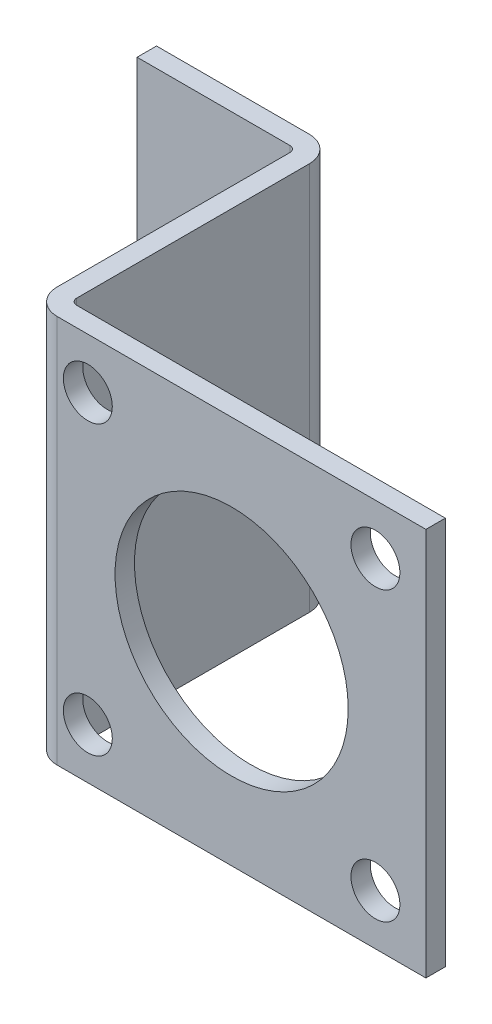
ISO-10303-21;
HEADER;
FILE_DESCRIPTION(('STEP AP214'),'2;1');
FILE_NAME('part.step','',(''),(''),'','','');
FILE_SCHEMA(('AUTOMOTIVE_DESIGN { 1 0 10303 214 1 1 1 1 }'));
ENDSEC;
DATA;
#1=APPLICATION_CONTEXT('core data for automotive mechanical design processes');
#2=APPLICATION_PROTOCOL_DEFINITION('international standard','automotive_design',2000,#1);
#3=PRODUCT_CONTEXT('',#1,'mechanical');
#4=PRODUCT('Part','Part','',(#3));
#5=PRODUCT_RELATED_PRODUCT_CATEGORY('part','',(#4));
#6=PRODUCT_DEFINITION_FORMATION('','',#4);
#7=PRODUCT_DEFINITION_CONTEXT('part definition',#1,'design');
#8=PRODUCT_DEFINITION('design','',#6,#7);
#9=PRODUCT_DEFINITION_SHAPE('','',#8);
#10=(LENGTH_UNIT() NAMED_UNIT(*) SI_UNIT(.MILLI.,.METRE.));
#11=(NAMED_UNIT(*) PLANE_ANGLE_UNIT() SI_UNIT($,.RADIAN.));
#12=(NAMED_UNIT(*) SI_UNIT($,.STERADIAN.) SOLID_ANGLE_UNIT());
#13=UNCERTAINTY_MEASURE_WITH_UNIT(LENGTH_MEASURE(1.E-05),#10,'distance_accuracy_value','');
#14=(GEOMETRIC_REPRESENTATION_CONTEXT(3) GLOBAL_UNCERTAINTY_ASSIGNED_CONTEXT((#13)) GLOBAL_UNIT_ASSIGNED_CONTEXT((#10,
#11,#12)) REPRESENTATION_CONTEXT('',''));
#15=CARTESIAN_POINT('',(0.,0.,0.));
#16=DIRECTION('',(0.,0.,1.));
#17=DIRECTION('',(1.,0.,0.));
#18=AXIS2_PLACEMENT_3D('',#15,#16,#17);
#19=CARTESIAN_POINT('',(-33.706943,31.75,-42.208958));
#20=DIRECTION('',(0.,-1.,0.));
#21=DIRECTION('',(0.,0.,-1.));
#22=AXIS2_PLACEMENT_3D('',#19,#20,#21);
#23=CYLINDRICAL_SURFACE('',#22,4.19100000000001);
#24=CARTESIAN_POINT('',(-33.706943,-31.75,-42.208958));
#25=DIRECTION('',(0.,1.,0.));
#26=DIRECTION('',(0.,0.,1.));
#27=AXIS2_PLACEMENT_3D('',#24,#25,#26);
#28=CIRCLE('',#27,4.19100000000001);
#29=CARTESIAN_POINT('',(-29.515943,-31.75,-42.208958));
#30=VERTEX_POINT('',#29);
#31=CARTESIAN_POINT('',(-33.706943,-31.75,-46.399958));
#32=VERTEX_POINT('',#31);
#33=EDGE_CURVE('E156',#30,#32,#28,.T.);
#34=ORIENTED_EDGE('',*,*,#33,.T.);
#35=DIRECTION('',(0.,-1.,0.));
#36=VECTOR('',#35,1.);
#37=CARTESIAN_POINT('',(-33.706943,31.75,-46.399958));
#38=LINE('',#37,#36);
#39=CARTESIAN_POINT('',(-33.706943,31.75,-46.399958));
#40=VERTEX_POINT('',#39);
#41=EDGE_CURVE('E11',#40,#32,#38,.T.);
#42=ORIENTED_EDGE('',*,*,#41,.F.);
#43=CARTESIAN_POINT('',(-33.706943,31.75,-42.208958));
#44=DIRECTION('',(0.,1.,0.));
#45=DIRECTION('',(0.,0.,1.));
#46=AXIS2_PLACEMENT_3D('',#43,#44,#45);
#47=CIRCLE('',#46,4.19100000000001);
#48=CARTESIAN_POINT('',(-29.515943,31.75,-42.208958));
#49=VERTEX_POINT('',#48);
#50=EDGE_CURVE('E186',#49,#40,#47,.T.);
#51=ORIENTED_EDGE('',*,*,#50,.F.);
#52=DIRECTION('',(0.,-1.,0.));
#53=VECTOR('',#52,1.);
#54=CARTESIAN_POINT('',(-29.515943,31.75,-42.208958));
#55=LINE('',#54,#53);
#56=EDGE_CURVE('E152',#49,#30,#55,.T.);
#57=ORIENTED_EDGE('',*,*,#56,.T.);
#58=EDGE_LOOP('',(#34,#42,#51,#57));
#59=FACE_BOUND('',#58,.T.);
#60=ADVANCED_FACE('F33',(#59),#23,.T.);
#61=CARTESIAN_POINT('',(-33.706943,31.75,-46.399958));
#62=DIRECTION('',(0.,0.,1.));
#63=DIRECTION('',(1.,0.,0.));
#64=AXIS2_PLACEMENT_3D('',#61,#62,#63);
#65=PLANE('',#64);
#66=DIRECTION('',(-1.,0.,0.));
#67=VECTOR('',#66,1.);
#68=CARTESIAN_POINT('',(-33.706943,-31.75,-46.399958));
#69=LINE('',#68,#67);
#70=CARTESIAN_POINT('',(-58.673873,-31.75,-46.399958));
#71=VERTEX_POINT('',#70);
#72=EDGE_CURVE('E159',#32,#71,#69,.T.);
#73=ORIENTED_EDGE('',*,*,#72,.T.);
#74=DIRECTION('',(0.,-1.,0.));
#75=VECTOR('',#74,1.);
#76=CARTESIAN_POINT('',(-58.673873,31.75,-46.399958));
#77=LINE('',#76,#75);
#78=CARTESIAN_POINT('',(-58.673873,31.75,-46.399958));
#79=VERTEX_POINT('',#78);
#80=EDGE_CURVE('E42',#79,#71,#77,.T.);
#81=ORIENTED_EDGE('',*,*,#80,.F.);
#82=DIRECTION('',(-1.,0.,0.));
#83=VECTOR('',#82,1.);
#84=CARTESIAN_POINT('',(-33.706943,31.75,-46.399958));
#85=LINE('',#84,#83);
#86=EDGE_CURVE('E106',#40,#79,#85,.T.);
#87=ORIENTED_EDGE('',*,*,#86,.F.);
#88=ORIENTED_EDGE('',*,*,#41,.T.);
#89=EDGE_LOOP('',(#73,#81,#87,#88));
#90=FACE_BOUND('',#89,.T.);
#91=ADVANCED_FACE('F277',(#90),#65,.F.);
#92=CARTESIAN_POINT('',(-58.673873,31.75,-43.224958));
#93=DIRECTION('',(-1.,0.,0.));
#94=DIRECTION('',(0.,0.,1.));
#95=AXIS2_PLACEMENT_3D('',#92,#93,#94);
#96=PLANE('',#95);
#97=DIRECTION('',(0.,0.,-1.));
#98=VECTOR('',#97,1.);
#99=CARTESIAN_POINT('',(-58.673873,-31.75,-43.224958));
#100=LINE('',#99,#98);
#101=CARTESIAN_POINT('',(-58.673873,-31.75,-43.224958));
#102=VERTEX_POINT('',#101);
#103=EDGE_CURVE('E163',#102,#71,#100,.T.);
#104=ORIENTED_EDGE('',*,*,#103,.F.);
#105=DIRECTION('',(0.,-1.,0.));
#106=VECTOR('',#105,1.);
#107=CARTESIAN_POINT('',(-58.673873,31.75,-43.224958));
#108=LINE('',#107,#106);
#109=CARTESIAN_POINT('',(-58.673873,31.75,-43.224958));
#110=VERTEX_POINT('',#109);
#111=EDGE_CURVE('E200',#110,#102,#108,.T.);
#112=ORIENTED_EDGE('',*,*,#111,.F.);
#113=DIRECTION('',(0.,0.,-1.));
#114=VECTOR('',#113,1.);
#115=CARTESIAN_POINT('',(-58.673873,31.75,-43.224958));
#116=LINE('',#115,#114);
#117=EDGE_CURVE('E233',#110,#79,#116,.T.);
#118=ORIENTED_EDGE('',*,*,#117,.T.);
#119=ORIENTED_EDGE('',*,*,#80,.T.);
#120=EDGE_LOOP('',(#104,#112,#118,#119));
#121=FACE_BOUND('',#120,.T.);
#122=ADVANCED_FACE('F282',(#121),#96,.T.);
#123=CARTESIAN_POINT('',(-33.706943,31.75,-43.224958));
#124=DIRECTION('',(0.,0.,1.));
#125=DIRECTION('',(1.,0.,0.));
#126=AXIS2_PLACEMENT_3D('',#123,#124,#125);
#127=PLANE('',#126);
#128=DIRECTION('',(-1.,0.,0.));
#129=VECTOR('',#128,1.);
#130=CARTESIAN_POINT('',(-33.706943,-31.75,-43.224958));
#131=LINE('',#130,#129);
#132=CARTESIAN_POINT('',(-33.706943,-31.75,-43.224958));
#133=VERTEX_POINT('',#132);
#134=EDGE_CURVE('E166',#133,#102,#131,.T.);
#135=ORIENTED_EDGE('',*,*,#134,.F.);
#136=DIRECTION('',(0.,-1.,0.));
#137=VECTOR('',#136,1.);
#138=CARTESIAN_POINT('',(-33.706943,31.75,-43.224958));
#139=LINE('',#138,#137);
#140=CARTESIAN_POINT('',(-33.706943,31.75,-43.224958));
#141=VERTEX_POINT('',#140);
#142=EDGE_CURVE('E198',#141,#133,#139,.T.);
#143=ORIENTED_EDGE('',*,*,#142,.F.);
#144=DIRECTION('',(-1.,0.,0.));
#145=VECTOR('',#144,1.);
#146=CARTESIAN_POINT('',(-33.706943,31.75,-43.224958));
#147=LINE('',#146,#145);
#148=EDGE_CURVE('E236',#141,#110,#147,.T.);
#149=ORIENTED_EDGE('',*,*,#148,.T.);
#150=ORIENTED_EDGE('',*,*,#111,.T.);
#151=EDGE_LOOP('',(#135,#143,#149,#150));
#152=FACE_BOUND('',#151,.T.);
#153=ADVANCED_FACE('F291',(#152),#127,.T.);
#154=CARTESIAN_POINT('',(-33.706943,31.75,-42.208958));
#155=DIRECTION('',(0.,-1.,0.));
#156=DIRECTION('',(0.,0.,-1.));
#157=AXIS2_PLACEMENT_3D('',#154,#155,#156);
#158=CYLINDRICAL_SURFACE('',#157,1.016);
#159=CARTESIAN_POINT('',(-33.706943,-31.75,-42.208958));
#160=DIRECTION('',(0.,1.,0.));
#161=DIRECTION('',(0.,0.,1.));
#162=AXIS2_PLACEMENT_3D('',#159,#160,#161);
#163=CIRCLE('',#162,1.016);
#164=CARTESIAN_POINT('',(-32.690943,-31.75,-42.208958));
#165=VERTEX_POINT('',#164);
#166=EDGE_CURVE('E169',#165,#133,#163,.T.);
#167=ORIENTED_EDGE('',*,*,#166,.F.);
#168=DIRECTION('',(0.,-1.,0.));
#169=VECTOR('',#168,1.);
#170=CARTESIAN_POINT('',(-32.690943,31.75,-42.208958));
#171=LINE('',#170,#169);
#172=CARTESIAN_POINT('',(-32.690943,31.75,-42.208958));
#173=VERTEX_POINT('',#172);
#174=EDGE_CURVE('E196',#173,#165,#171,.T.);
#175=ORIENTED_EDGE('',*,*,#174,.F.);
#176=CARTESIAN_POINT('',(-33.706943,31.75,-42.208958));
#177=DIRECTION('',(0.,1.,0.));
#178=DIRECTION('',(0.,0.,1.));
#179=AXIS2_PLACEMENT_3D('',#176,#177,#178);
#180=CIRCLE('',#179,1.016);
#181=EDGE_CURVE('E239',#173,#141,#180,.T.);
#182=ORIENTED_EDGE('',*,*,#181,.T.);
#183=ORIENTED_EDGE('',*,*,#142,.T.);
#184=EDGE_LOOP('',(#167,#175,#182,#183));
#185=FACE_BOUND('',#184,.T.);
#186=ADVANCED_FACE('F294',(#185),#158,.F.);
#187=CARTESIAN_POINT('',(-32.690943,31.75,-4.19099999999999));
#188=DIRECTION('',(-1.,0.,0.));
#189=DIRECTION('',(0.,0.,1.));
#190=AXIS2_PLACEMENT_3D('',#187,#188,#189);
#191=PLANE('',#190);
#192=DIRECTION('',(0.,0.,-1.));
#193=VECTOR('',#192,1.);
#194=CARTESIAN_POINT('',(-32.690943,-31.75,-4.19099999999999));
#195=LINE('',#194,#193);
#196=CARTESIAN_POINT('',(-32.690943,-31.75,-4.19099999999999));
#197=VERTEX_POINT('',#196);
#198=EDGE_CURVE('E172',#197,#165,#195,.T.);
#199=ORIENTED_EDGE('',*,*,#198,.F.);
#200=DIRECTION('',(0.,-1.,0.));
#201=VECTOR('',#200,1.);
#202=CARTESIAN_POINT('',(-32.690943,31.75,-4.19099999999999));
#203=LINE('',#202,#201);
#204=CARTESIAN_POINT('',(-32.690943,31.75,-4.19099999999999));
#205=VERTEX_POINT('',#204);
#206=EDGE_CURVE('E194',#205,#197,#203,.T.);
#207=ORIENTED_EDGE('',*,*,#206,.F.);
#208=DIRECTION('',(0.,0.,-1.));
#209=VECTOR('',#208,1.);
#210=CARTESIAN_POINT('',(-32.690943,31.75,-4.19099999999999));
#211=LINE('',#210,#209);
#212=EDGE_CURVE('E242',#205,#173,#211,.T.);
#213=ORIENTED_EDGE('',*,*,#212,.T.);
#214=ORIENTED_EDGE('',*,*,#174,.T.);
#215=EDGE_LOOP('',(#199,#207,#213,#214));
#216=FACE_BOUND('',#215,.T.);
#217=ADVANCED_FACE('F296',(#216),#191,.T.);
#218=CARTESIAN_POINT('',(-28.499943,31.75,-4.19099999999999));
#219=DIRECTION('',(0.,-1.,0.));
#220=DIRECTION('',(0.,0.,-1.));
#221=AXIS2_PLACEMENT_3D('',#218,#219,#220);
#222=CYLINDRICAL_SURFACE('',#221,4.191);
#223=CARTESIAN_POINT('',(-28.499943,-31.75,-4.19099999999999));
#224=DIRECTION('',(0.,-1.,0.));
#225=DIRECTION('',(0.,0.,-1.));
#226=AXIS2_PLACEMENT_3D('',#223,#224,#225);
#227=CIRCLE('',#226,4.191);
#228=CARTESIAN_POINT('',(-28.499943,-31.75,0.));
#229=VERTEX_POINT('',#228);
#230=EDGE_CURVE('E175',#229,#197,#227,.T.);
#231=ORIENTED_EDGE('',*,*,#230,.F.);
#232=DIRECTION('',(0.,-1.,0.));
#233=VECTOR('',#232,1.);
#234=CARTESIAN_POINT('',(-28.499943,31.75,0.));
#235=LINE('',#234,#233);
#236=CARTESIAN_POINT('',(-28.499943,31.75,0.));
#237=VERTEX_POINT('',#236);
#238=EDGE_CURVE('E192',#237,#229,#235,.T.);
#239=ORIENTED_EDGE('',*,*,#238,.F.);
#240=CARTESIAN_POINT('',(-28.499943,31.75,-4.19099999999999));
#241=DIRECTION('',(0.,-1.,0.));
#242=DIRECTION('',(0.,0.,-1.));
#243=AXIS2_PLACEMENT_3D('',#240,#241,#242);
#244=CIRCLE('',#243,4.191);
#245=EDGE_CURVE('E245',#237,#205,#244,.T.);
#246=ORIENTED_EDGE('',*,*,#245,.T.);
#247=ORIENTED_EDGE('',*,*,#206,.T.);
#248=EDGE_LOOP('',(#231,#239,#246,#247));
#249=FACE_BOUND('',#248,.T.);
#250=ADVANCED_FACE('F258',(#249),#222,.T.);
#251=CARTESIAN_POINT('',(31.75,31.75,0.));
#252=DIRECTION('',(0.,0.,1.));
#253=DIRECTION('',(1.,0.,0.));
#254=AXIS2_PLACEMENT_3D('',#251,#252,#253);
#255=PLANE('',#254);
#256=CARTESIAN_POINT('',(23.5,23.5,0.));
#257=DIRECTION('',(0.,0.,1.));
#258=DIRECTION('',(1.,0.,0.));
#259=AXIS2_PLACEMENT_3D('',#256,#257,#258);
#260=CIRCLE('',#259,4.);
#261=CARTESIAN_POINT('',(27.5,23.5,0.));
#262=VERTEX_POINT('',#261);
#263=EDGE_CURVE('E206',#262,#262,#260,.T.);
#264=ORIENTED_EDGE('',*,*,#263,.F.);
#265=EDGE_LOOP('',(#264));
#266=FACE_BOUND('',#265,.T.);
#267=CARTESIAN_POINT('',(23.5,-23.5,0.));
#268=DIRECTION('',(0.,0.,1.));
#269=DIRECTION('',(1.,0.,0.));
#270=AXIS2_PLACEMENT_3D('',#267,#268,#269);
#271=CIRCLE('',#270,4.);
#272=CARTESIAN_POINT('',(27.5,-23.5,0.));
#273=VERTEX_POINT('',#272);
#274=EDGE_CURVE('E216',#273,#273,#271,.T.);
#275=ORIENTED_EDGE('',*,*,#274,.F.);
#276=EDGE_LOOP('',(#275));
#277=FACE_BOUND('',#276,.T.);
#278=CARTESIAN_POINT('',(-23.5,-23.5,0.));
#279=DIRECTION('',(0.,0.,1.));
#280=DIRECTION('',(1.,0.,0.));
#281=AXIS2_PLACEMENT_3D('',#278,#279,#280);
#282=CIRCLE('',#281,4.);
#283=CARTESIAN_POINT('',(-19.5,-23.5,0.));
#284=VERTEX_POINT('',#283);
#285=EDGE_CURVE('E213',#284,#284,#282,.T.);
#286=ORIENTED_EDGE('',*,*,#285,.F.);
#287=EDGE_LOOP('',(#286));
#288=FACE_BOUND('',#287,.T.);
#289=CARTESIAN_POINT('',(-23.5,23.5,0.));
#290=DIRECTION('',(0.,0.,1.));
#291=DIRECTION('',(1.,0.,0.));
#292=AXIS2_PLACEMENT_3D('',#289,#290,#291);
#293=CIRCLE('',#292,4.);
#294=CARTESIAN_POINT('',(-19.5,23.5,0.));
#295=VERTEX_POINT('',#294);
#296=EDGE_CURVE('E210',#295,#295,#293,.T.);
#297=ORIENTED_EDGE('',*,*,#296,.F.);
#298=EDGE_LOOP('',(#297));
#299=FACE_BOUND('',#298,.T.);
#300=CARTESIAN_POINT('',(0.,0.,0.));
#301=DIRECTION('',(0.,0.,1.));
#302=DIRECTION('',(1.,0.,0.));
#303=AXIS2_PLACEMENT_3D('',#300,#301,#302);
#304=CIRCLE('',#303,19.05);
#305=CARTESIAN_POINT('',(19.05,0.,0.));
#306=VERTEX_POINT('',#305);
#307=EDGE_CURVE('E160',#306,#306,#304,.T.);
#308=ORIENTED_EDGE('',*,*,#307,.F.);
#309=EDGE_LOOP('',(#308));
#310=FACE_BOUND('',#309,.T.);
#311=DIRECTION('',(-1.,0.,0.));
#312=VECTOR('',#311,1.);
#313=CARTESIAN_POINT('',(31.75,-31.75,0.));
#314=LINE('',#313,#312);
#315=CARTESIAN_POINT('',(31.75,-31.75,0.));
#316=VERTEX_POINT('',#315);
#317=EDGE_CURVE('E178',#316,#229,#314,.T.);
#318=ORIENTED_EDGE('',*,*,#317,.F.);
#319=DIRECTION('',(0.,-1.,0.));
#320=VECTOR('',#319,1.);
#321=CARTESIAN_POINT('',(31.75,31.75,0.));
#322=LINE('',#321,#320);
#323=CARTESIAN_POINT('',(31.75,31.75,0.));
#324=VERTEX_POINT('',#323);
#325=EDGE_CURVE('E190',#324,#316,#322,.T.);
#326=ORIENTED_EDGE('',*,*,#325,.F.);
#327=DIRECTION('',(-1.,0.,0.));
#328=VECTOR('',#327,1.);
#329=CARTESIAN_POINT('',(31.75,31.75,0.));
#330=LINE('',#329,#328);
#331=EDGE_CURVE('E248',#324,#237,#330,.T.);
#332=ORIENTED_EDGE('',*,*,#331,.T.);
#333=ORIENTED_EDGE('',*,*,#238,.T.);
#334=EDGE_LOOP('',(#318,#326,#332,#333));
#335=FACE_BOUND('',#334,.T.);
#336=ADVANCED_FACE('F252',(#266,#277,#288,#299,#310,#335),#255,.T.);
#337=CARTESIAN_POINT('',(31.75,31.75,0.));
#338=DIRECTION('',(-1.,0.,0.));
#339=DIRECTION('',(0.,0.,1.));
#340=AXIS2_PLACEMENT_3D('',#337,#338,#339);
#341=PLANE('',#340);
#342=DIRECTION('',(0.,0.,-1.));
#343=VECTOR('',#342,1.);
#344=CARTESIAN_POINT('',(31.75,-31.75,0.));
#345=LINE('',#344,#343);
#346=CARTESIAN_POINT('',(31.75,-31.75,-3.175));
#347=VERTEX_POINT('',#346);
#348=EDGE_CURVE('E181',#316,#347,#345,.T.);
#349=ORIENTED_EDGE('',*,*,#348,.T.);
#350=DIRECTION('',(0.,-1.,0.));
#351=VECTOR('',#350,1.);
#352=CARTESIAN_POINT('',(31.75,31.75,-3.175));
#353=LINE('',#352,#351);
#354=CARTESIAN_POINT('',(31.75,31.75,-3.175));
#355=VERTEX_POINT('',#354);
#356=EDGE_CURVE('E147',#355,#347,#353,.T.);
#357=ORIENTED_EDGE('',*,*,#356,.F.);
#358=DIRECTION('',(0.,0.,-1.));
#359=VECTOR('',#358,1.);
#360=CARTESIAN_POINT('',(31.75,31.75,0.));
#361=LINE('',#360,#359);
#362=EDGE_CURVE('E138',#324,#355,#361,.T.);
#363=ORIENTED_EDGE('',*,*,#362,.F.);
#364=ORIENTED_EDGE('',*,*,#325,.T.);
#365=EDGE_LOOP('',(#349,#357,#363,#364));
#366=FACE_BOUND('',#365,.T.);
#367=ADVANCED_FACE('F265',(#366),#341,.F.);
#368=CARTESIAN_POINT('',(31.75,31.75,-3.175));
#369=DIRECTION('',(0.,0.,1.));
#370=DIRECTION('',(1.,0.,0.));
#371=AXIS2_PLACEMENT_3D('',#368,#369,#370);
#372=PLANE('',#371);
#373=CARTESIAN_POINT('',(23.5,23.5,-3.175));
#374=DIRECTION('',(0.,0.,1.));
#375=DIRECTION('',(1.,0.,0.));
#376=AXIS2_PLACEMENT_3D('',#373,#374,#375);
#377=CIRCLE('',#376,4.);
#378=CARTESIAN_POINT('',(27.5,23.5,-3.175));
#379=VERTEX_POINT('',#378);
#380=EDGE_CURVE('E36',#379,#379,#377,.T.);
#381=ORIENTED_EDGE('',*,*,#380,.T.);
#382=EDGE_LOOP('',(#381));
#383=FACE_BOUND('',#382,.T.);
#384=CARTESIAN_POINT('',(23.5,-23.5,-3.175));
#385=DIRECTION('',(0.,0.,1.));
#386=DIRECTION('',(1.,0.,0.));
#387=AXIS2_PLACEMENT_3D('',#384,#385,#386);
#388=CIRCLE('',#387,4.);
#389=CARTESIAN_POINT('',(27.5,-23.5,-3.175));
#390=VERTEX_POINT('',#389);
#391=EDGE_CURVE('E214',#390,#390,#388,.T.);
#392=ORIENTED_EDGE('',*,*,#391,.T.);
#393=EDGE_LOOP('',(#392));
#394=FACE_BOUND('',#393,.T.);
#395=CARTESIAN_POINT('',(-23.5,-23.5,-3.17499999999999));
#396=DIRECTION('',(0.,0.,1.));
#397=DIRECTION('',(1.,0.,0.));
#398=AXIS2_PLACEMENT_3D('',#395,#396,#397);
#399=CIRCLE('',#398,4.);
#400=CARTESIAN_POINT('',(-19.5,-23.5,-3.17499999999999));
#401=VERTEX_POINT('',#400);
#402=EDGE_CURVE('E211',#401,#401,#399,.T.);
#403=ORIENTED_EDGE('',*,*,#402,.T.);
#404=EDGE_LOOP('',(#403));
#405=FACE_BOUND('',#404,.T.);
#406=CARTESIAN_POINT('',(-23.5,23.5,-3.17499999999999));
#407=DIRECTION('',(0.,0.,1.));
#408=DIRECTION('',(1.,0.,0.));
#409=AXIS2_PLACEMENT_3D('',#406,#407,#408);
#410=CIRCLE('',#409,4.);
#411=CARTESIAN_POINT('',(-19.5,23.5,-3.17499999999999));
#412=VERTEX_POINT('',#411);
#413=EDGE_CURVE('E207',#412,#412,#410,.T.);
#414=ORIENTED_EDGE('',*,*,#413,.T.);
#415=EDGE_LOOP('',(#414));
#416=FACE_BOUND('',#415,.T.);
#417=CARTESIAN_POINT('',(0.,0.,-3.17499999999999));
#418=DIRECTION('',(0.,0.,1.));
#419=DIRECTION('',(1.,0.,0.));
#420=AXIS2_PLACEMENT_3D('',#417,#418,#419);
#421=CIRCLE('',#420,19.05);
#422=CARTESIAN_POINT('',(19.05,0.,-3.17499999999999));
#423=VERTEX_POINT('',#422);
#424=EDGE_CURVE('E203',#423,#423,#421,.T.);
#425=ORIENTED_EDGE('',*,*,#424,.T.);
#426=EDGE_LOOP('',(#425));
#427=FACE_BOUND('',#426,.T.);
#428=DIRECTION('',(-1.,0.,0.));
#429=VECTOR('',#428,1.);
#430=CARTESIAN_POINT('',(31.75,-31.75,-3.175));
#431=LINE('',#430,#429);
#432=CARTESIAN_POINT('',(-28.499943,-31.75,-3.17499999999999));
#433=VERTEX_POINT('',#432);
#434=EDGE_CURVE('E146',#347,#433,#431,.T.);
#435=ORIENTED_EDGE('',*,*,#434,.T.);
#436=DIRECTION('',(0.,-1.,0.));
#437=VECTOR('',#436,1.);
#438=CARTESIAN_POINT('',(-28.499943,31.75,-3.17499999999999));
#439=LINE('',#438,#437);
#440=CARTESIAN_POINT('',(-28.499943,31.75,-3.17499999999999));
#441=VERTEX_POINT('',#440);
#442=EDGE_CURVE('E143',#441,#433,#439,.T.);
#443=ORIENTED_EDGE('',*,*,#442,.F.);
#444=DIRECTION('',(-1.,0.,0.));
#445=VECTOR('',#444,1.);
#446=CARTESIAN_POINT('',(31.75,31.75,-3.175));
#447=LINE('',#446,#445);
#448=EDGE_CURVE('E131',#355,#441,#447,.T.);
#449=ORIENTED_EDGE('',*,*,#448,.F.);
#450=ORIENTED_EDGE('',*,*,#356,.T.);
#451=EDGE_LOOP('',(#435,#443,#449,#450));
#452=FACE_BOUND('',#451,.T.);
#453=ADVANCED_FACE('F144',(#383,#394,#405,#416,#427,#452),#372,.F.);
#454=CARTESIAN_POINT('',(-28.499943,31.75,-4.19099999999999));
#455=DIRECTION('',(0.,-1.,0.));
#456=DIRECTION('',(0.,0.,-1.));
#457=AXIS2_PLACEMENT_3D('',#454,#455,#456);
#458=CYLINDRICAL_SURFACE('',#457,1.016);
#459=CARTESIAN_POINT('',(-28.499943,-31.75,-4.19099999999999));
#460=DIRECTION('',(0.,-1.,0.));
#461=DIRECTION('',(0.,0.,-1.));
#462=AXIS2_PLACEMENT_3D('',#459,#460,#461);
#463=CIRCLE('',#462,1.016);
#464=CARTESIAN_POINT('',(-29.515943,-31.75,-4.19099999999999));
#465=VERTEX_POINT('',#464);
#466=EDGE_CURVE('E92',#433,#465,#463,.T.);
#467=ORIENTED_EDGE('',*,*,#466,.T.);
#468=DIRECTION('',(0.,-1.,0.));
#469=VECTOR('',#468,1.);
#470=CARTESIAN_POINT('',(-29.515943,31.75,-4.19099999999999));
#471=LINE('',#470,#469);
#472=CARTESIAN_POINT('',(-29.515943,31.75,-4.19099999999999));
#473=VERTEX_POINT('',#472);
#474=EDGE_CURVE('E148',#473,#465,#471,.T.);
#475=ORIENTED_EDGE('',*,*,#474,.F.);
#476=CARTESIAN_POINT('',(-28.499943,31.75,-4.19099999999999));
#477=DIRECTION('',(0.,-1.,0.));
#478=DIRECTION('',(0.,0.,-1.));
#479=AXIS2_PLACEMENT_3D('',#476,#477,#478);
#480=CIRCLE('',#479,1.016);
#481=EDGE_CURVE('E135',#441,#473,#480,.T.);
#482=ORIENTED_EDGE('',*,*,#481,.F.);
#483=ORIENTED_EDGE('',*,*,#442,.T.);
#484=EDGE_LOOP('',(#467,#475,#482,#483));
#485=FACE_BOUND('',#484,.T.);
#486=ADVANCED_FACE('F150',(#485),#458,.F.);
#487=CARTESIAN_POINT('',(-29.515943,31.75,-4.19099999999999));
#488=DIRECTION('',(-1.,0.,0.));
#489=DIRECTION('',(0.,0.,1.));
#490=AXIS2_PLACEMENT_3D('',#487,#488,#489);
#491=PLANE('',#490);
#492=DIRECTION('',(0.,0.,-1.));
#493=VECTOR('',#492,1.);
#494=CARTESIAN_POINT('',(-29.515943,-31.75,-4.19099999999999));
#495=LINE('',#494,#493);
#496=EDGE_CURVE('E98',#465,#30,#495,.T.);
#497=ORIENTED_EDGE('',*,*,#496,.T.);
#498=ORIENTED_EDGE('',*,*,#56,.F.);
#499=DIRECTION('',(0.,0.,-1.));
#500=VECTOR('',#499,1.);
#501=CARTESIAN_POINT('',(-29.515943,31.75,-4.19099999999999));
#502=LINE('',#501,#500);
#503=EDGE_CURVE('E51',#473,#49,#502,.T.);
#504=ORIENTED_EDGE('',*,*,#503,.F.);
#505=ORIENTED_EDGE('',*,*,#474,.T.);
#506=EDGE_LOOP('',(#497,#498,#504,#505));
#507=FACE_BOUND('',#506,.T.);
#508=ADVANCED_FACE('F346',(#507),#491,.F.);
#509=CARTESIAN_POINT('',(-33.706943,31.75,-42.208958));
#510=DIRECTION('',(0.,1.,0.));
#511=DIRECTION('',(0.,0.,1.));
#512=AXIS2_PLACEMENT_3D('',#509,#510,#511);
#513=PLANE('',#512);
#514=ORIENTED_EDGE('',*,*,#50,.T.);
#515=ORIENTED_EDGE('',*,*,#86,.T.);
#516=ORIENTED_EDGE('',*,*,#117,.F.);
#517=ORIENTED_EDGE('',*,*,#148,.F.);
#518=ORIENTED_EDGE('',*,*,#181,.F.);
#519=ORIENTED_EDGE('',*,*,#212,.F.);
#520=ORIENTED_EDGE('',*,*,#245,.F.);
#521=ORIENTED_EDGE('',*,*,#331,.F.);
#522=ORIENTED_EDGE('',*,*,#362,.T.);
#523=ORIENTED_EDGE('',*,*,#448,.T.);
#524=ORIENTED_EDGE('',*,*,#481,.T.);
#525=ORIENTED_EDGE('',*,*,#503,.T.);
#526=EDGE_LOOP('',(#514,#515,#516,#517,#518,#519,#520,#521,#522,#523,#524,#525));
#527=FACE_BOUND('',#526,.T.);
#528=ADVANCED_FACE('F133',(#527),#513,.T.);
#529=CARTESIAN_POINT('',(-33.706943,-31.75,-42.208958));
#530=DIRECTION('',(0.,1.,0.));
#531=DIRECTION('',(0.,0.,1.));
#532=AXIS2_PLACEMENT_3D('',#529,#530,#531);
#533=PLANE('',#532);
#534=ORIENTED_EDGE('',*,*,#33,.F.);
#535=ORIENTED_EDGE('',*,*,#496,.F.);
#536=ORIENTED_EDGE('',*,*,#466,.F.);
#537=ORIENTED_EDGE('',*,*,#434,.F.);
#538=ORIENTED_EDGE('',*,*,#348,.F.);
#539=ORIENTED_EDGE('',*,*,#317,.T.);
#540=ORIENTED_EDGE('',*,*,#230,.T.);
#541=ORIENTED_EDGE('',*,*,#198,.T.);
#542=ORIENTED_EDGE('',*,*,#166,.T.);
#543=ORIENTED_EDGE('',*,*,#134,.T.);
#544=ORIENTED_EDGE('',*,*,#103,.T.);
#545=ORIENTED_EDGE('',*,*,#72,.F.);
#546=EDGE_LOOP('',(#534,#535,#536,#537,#538,#539,#540,#541,#542,#543,#544,#545));
#547=FACE_BOUND('',#546,.T.);
#548=ADVANCED_FACE('F263',(#547),#533,.F.);
#549=CARTESIAN_POINT('',(0.,0.,-46.399958));
#550=DIRECTION('',(0.,0.,1.));
#551=DIRECTION('',(1.,0.,0.));
#552=AXIS2_PLACEMENT_3D('',#549,#550,#551);
#553=CYLINDRICAL_SURFACE('',#552,19.05);
#554=ORIENTED_EDGE('',*,*,#307,.T.);
#555=EDGE_LOOP('',(#554));
#556=FACE_BOUND('',#555,.T.);
#557=ORIENTED_EDGE('',*,*,#424,.F.);
#558=EDGE_LOOP('',(#557));
#559=FACE_BOUND('',#558,.T.);
#560=ADVANCED_FACE('F371',(#556,#559),#553,.F.);
#561=CARTESIAN_POINT('',(-23.5,23.5,-46.399958));
#562=DIRECTION('',(0.,0.,1.));
#563=DIRECTION('',(1.,0.,0.));
#564=AXIS2_PLACEMENT_3D('',#561,#562,#563);
#565=CYLINDRICAL_SURFACE('',#564,4.);
#566=ORIENTED_EDGE('',*,*,#296,.T.);
#567=EDGE_LOOP('',(#566));
#568=FACE_BOUND('',#567,.T.);
#569=ORIENTED_EDGE('',*,*,#413,.F.);
#570=EDGE_LOOP('',(#569));
#571=FACE_BOUND('',#570,.T.);
#572=ADVANCED_FACE('F390',(#568,#571),#565,.F.);
#573=CARTESIAN_POINT('',(-23.5,-23.5,-46.399958));
#574=DIRECTION('',(0.,0.,1.));
#575=DIRECTION('',(1.,0.,0.));
#576=AXIS2_PLACEMENT_3D('',#573,#574,#575);
#577=CYLINDRICAL_SURFACE('',#576,4.);
#578=ORIENTED_EDGE('',*,*,#285,.T.);
#579=EDGE_LOOP('',(#578));
#580=FACE_BOUND('',#579,.T.);
#581=ORIENTED_EDGE('',*,*,#402,.F.);
#582=EDGE_LOOP('',(#581));
#583=FACE_BOUND('',#582,.T.);
#584=ADVANCED_FACE('F400',(#580,#583),#577,.F.);
#585=CARTESIAN_POINT('',(23.5,-23.5,-46.399958));
#586=DIRECTION('',(0.,0.,1.));
#587=DIRECTION('',(1.,0.,0.));
#588=AXIS2_PLACEMENT_3D('',#585,#586,#587);
#589=CYLINDRICAL_SURFACE('',#588,4.);
#590=ORIENTED_EDGE('',*,*,#274,.T.);
#591=EDGE_LOOP('',(#590));
#592=FACE_BOUND('',#591,.T.);
#593=ORIENTED_EDGE('',*,*,#391,.F.);
#594=EDGE_LOOP('',(#593));
#595=FACE_BOUND('',#594,.T.);
#596=ADVANCED_FACE('F410',(#592,#595),#589,.F.);
#597=CARTESIAN_POINT('',(23.5,23.5,-46.399958));
#598=DIRECTION('',(0.,0.,1.));
#599=DIRECTION('',(1.,0.,0.));
#600=AXIS2_PLACEMENT_3D('',#597,#598,#599);
#601=CYLINDRICAL_SURFACE('',#600,4.);
#602=ORIENTED_EDGE('',*,*,#263,.T.);
#603=EDGE_LOOP('',(#602));
#604=FACE_BOUND('',#603,.T.);
#605=ORIENTED_EDGE('',*,*,#380,.F.);
#606=EDGE_LOOP('',(#605));
#607=FACE_BOUND('',#606,.T.);
#608=ADVANCED_FACE('F419',(#604,#607),#601,.F.);
#609=CLOSED_SHELL('',(#60,#91,#122,#153,#186,#217,#250,#336,#367,#453,#486,#508,#528,#548,#560,
#572,#584,#596,#608));
#610=MANIFOLD_SOLID_BREP('B2',#609);
#611=ADVANCED_BREP_SHAPE_REPRESENTATION('',(#18,#610),#14);
#612=SHAPE_DEFINITION_REPRESENTATION(#9,#611);
ENDSEC;
END-ISO-10303-21;
